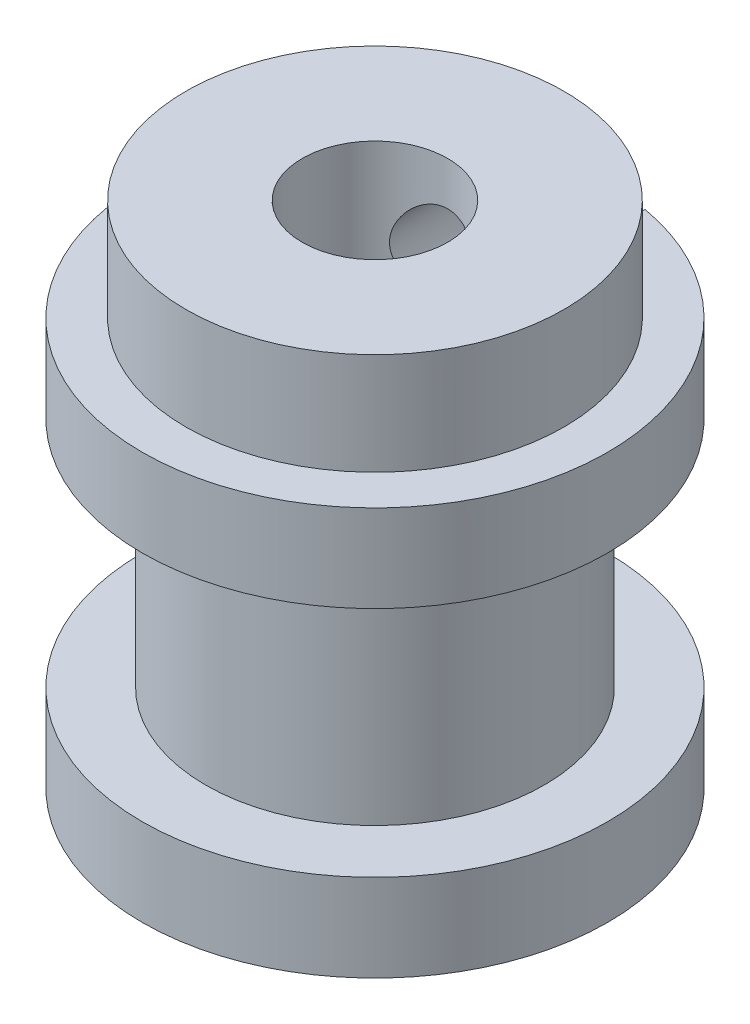
ISO-10303-21;
HEADER;
FILE_DESCRIPTION(('STEP AP214'),'2;1');
FILE_NAME('part.step','',(''),(''),'','','');
FILE_SCHEMA(('AUTOMOTIVE_DESIGN { 1 0 10303 214 1 1 1 1 }'));
ENDSEC;
DATA;
#1=APPLICATION_CONTEXT('core data for automotive mechanical design processes');
#2=APPLICATION_PROTOCOL_DEFINITION('international standard','automotive_design',2000,#1);
#3=PRODUCT_CONTEXT('',#1,'mechanical');
#4=PRODUCT('Part','Part','',(#3));
#5=PRODUCT_RELATED_PRODUCT_CATEGORY('part','',(#4));
#6=PRODUCT_DEFINITION_FORMATION('','',#4);
#7=PRODUCT_DEFINITION_CONTEXT('part definition',#1,'design');
#8=PRODUCT_DEFINITION('design','',#6,#7);
#9=PRODUCT_DEFINITION_SHAPE('','',#8);
#10=(LENGTH_UNIT() NAMED_UNIT(*) SI_UNIT(.MILLI.,.METRE.));
#11=(NAMED_UNIT(*) PLANE_ANGLE_UNIT() SI_UNIT($,.RADIAN.));
#12=(NAMED_UNIT(*) SI_UNIT($,.STERADIAN.) SOLID_ANGLE_UNIT());
#13=UNCERTAINTY_MEASURE_WITH_UNIT(LENGTH_MEASURE(1.E-05),#10,'distance_accuracy_value','');
#14=(GEOMETRIC_REPRESENTATION_CONTEXT(3) GLOBAL_UNCERTAINTY_ASSIGNED_CONTEXT((#13)) GLOBAL_UNIT_ASSIGNED_CONTEXT((#10,
#11,#12)) REPRESENTATION_CONTEXT('',''));
#15=CARTESIAN_POINT('',(0.,0.,0.));
#16=DIRECTION('',(0.,0.,1.));
#17=DIRECTION('',(1.,0.,0.));
#18=AXIS2_PLACEMENT_3D('',#15,#16,#17);
#19=CARTESIAN_POINT('',(8.,-7.,0.));
#20=DIRECTION('',(0.,1.,0.));
#21=DIRECTION('',(0.,0.,1.));
#22=AXIS2_PLACEMENT_3D('',#19,#20,#21);
#23=PLANE('',#22);
#24=CARTESIAN_POINT('',(0.,-7.,0.));
#25=DIRECTION('',(0.,1.,0.));
#26=DIRECTION('',(0.,0.,1.));
#27=AXIS2_PLACEMENT_3D('',#24,#25,#26);
#28=CIRCLE('',#27,8.);
#29=CARTESIAN_POINT('',(0.,-7.,8.));
#30=VERTEX_POINT('',#29);
#31=EDGE_CURVE('E127',#30,#30,#28,.T.);
#32=ORIENTED_EDGE('',*,*,#31,.F.);
#33=EDGE_LOOP('',(#32));
#34=FACE_BOUND('',#33,.T.);
#35=CARTESIAN_POINT('',(0.,-7.,0.));
#36=DIRECTION('',(0.,1.,0.));
#37=DIRECTION('',(0.,0.,1.));
#38=AXIS2_PLACEMENT_3D('',#35,#36,#37);
#39=CIRCLE('',#38,2.5);
#40=CARTESIAN_POINT('',(0.,-7.,2.5));
#41=VERTEX_POINT('',#40);
#42=EDGE_CURVE('E60',#41,#41,#39,.T.);
#43=ORIENTED_EDGE('',*,*,#42,.T.);
#44=EDGE_LOOP('',(#43));
#45=FACE_BOUND('',#44,.T.);
#46=ADVANCED_FACE('F48',(#34,#45),#23,.F.);
#47=CARTESIAN_POINT('',(0.,5.91926868955007,0.));
#48=DIRECTION('',(0.,1.,0.));
#49=DIRECTION('',(0.,0.,1.));
#50=AXIS2_PLACEMENT_3D('',#47,#48,#49);
#51=CYLINDRICAL_SURFACE('',#50,2.5);
#52=CARTESIAN_POINT('',(1.5,7.5,-2.));
#53=CARTESIAN_POINT('',(1.50000404108592,7.42452102471037,-1.99999416642512));
#54=CARTESIAN_POINT('',(1.49426852824014,7.34906156592021,-2.00433633903481));
#55=CARTESIAN_POINT('',(1.47174965152787,7.20067609603779,-2.02092590613883));
#56=CARTESIAN_POINT('',(1.45495475788936,7.1277528126149,-2.03318155043097));
#57=CARTESIAN_POINT('',(1.41143486335795,6.98691635832273,-2.0636233903473));
#58=CARTESIAN_POINT('',(1.3847815450315,6.91897116196473,-2.0817666618312));
#59=CARTESIAN_POINT('',(1.32252909283019,6.78856254663208,-2.12185904995836));
#60=CARTESIAN_POINT('',(1.28692729054693,6.72610077030486,-2.14380930122416));
#61=CARTESIAN_POINT('',(1.20271292747644,6.60005098333592,-2.19228594587542));
#62=CARTESIAN_POINT('',(1.15304179435289,6.53725904287606,-2.21904371037662));
#63=CARTESIAN_POINT('',(1.04426801309985,6.42023523725825,-2.27226229431061));
#64=CARTESIAN_POINT('',(0.985158296729613,6.3660098483292,-2.29872287517103));
#65=CARTESIAN_POINT('',(0.851442367411702,6.26186619029031,-2.35175567858734));
#66=CARTESIAN_POINT('',(0.775851995162548,6.21304553633025,-2.37803133577818));
#67=CARTESIAN_POINT('',(0.615654228271658,6.12919027755557,-2.42443786983179));
#68=CARTESIAN_POINT('',(0.53105519662633,6.09414302587729,-2.44457437988735));
#69=CARTESIAN_POINT('',(0.363771406742666,6.04240407718735,-2.4747098780044));
#70=CARTESIAN_POINT('',(0.281674698130915,6.02427963903271,-2.4854930393917));
#71=CARTESIAN_POINT('',(0.114970509382708,6.00205719713688,-2.49874939277545));
#72=CARTESIAN_POINT('',(0.0303654624001537,5.99794602199995,-2.50123038813308));
#73=CARTESIAN_POINT('',(-0.127637283737309,6.00361374734246,-2.49783372711539));
#74=CARTESIAN_POINT('',(-0.201123832865634,6.01173352616931,-2.49295437513726));
#75=CARTESIAN_POINT('',(-0.345464269151767,6.03847979564811,-2.47707997553857));
#76=CARTESIAN_POINT('',(-0.416317961051201,6.05710706390716,-2.46608447529309));
#77=CARTESIAN_POINT('',(-0.554056780469079,6.10416556270378,-2.4388490720172));
#78=CARTESIAN_POINT('',(-0.620916491037617,6.132653061139,-2.42257910450824));
#79=CARTESIAN_POINT('',(-0.74898866011561,6.19838461622554,-2.38609637638748));
#80=CARTESIAN_POINT('',(-0.810199646208011,6.23563094705901,-2.36588259201812));
#81=CARTESIAN_POINT('',(-0.933074267143199,6.32283909280445,-2.32037925976363));
#82=CARTESIAN_POINT('',(-0.993918663198193,6.37378831173574,-2.2947718295215));
#83=CARTESIAN_POINT('',(-1.10671465909274,6.48440411786018,-2.24255554245601));
#84=CARTESIAN_POINT('',(-1.1586540130834,6.54408250347451,-2.21594536703375));
#85=CARTESIAN_POINT('',(-1.25824837767417,6.67865340616356,-2.16111075123946));
#86=CARTESIAN_POINT('',(-1.30470933188632,6.75450757653946,-2.13305661385124));
#87=CARTESIAN_POINT('',(-1.38397217194232,6.91470623163661,-2.08250879557267));
#88=CARTESIAN_POINT('',(-1.41679921962189,6.99903471612564,-2.06000490298821));
#89=CARTESIAN_POINT('',(-1.46077497064842,7.15239363189535,-2.02895865196732));
#90=CARTESIAN_POINT('',(-1.47527903312665,7.22004063229665,-2.01833888618316));
#91=CARTESIAN_POINT('',(-1.49480872755284,7.35737361029948,-2.00392150777558));
#92=CARTESIAN_POINT('',(-1.49984538302907,7.42705712048457,-2.00011596115116));
#93=CARTESIAN_POINT('',(-1.50014781114183,7.56655168243571,-1.99988914321323));
#94=CARTESIAN_POINT('',(-1.49540004697659,7.63636277721521,-2.00347810223984));
#95=CARTESIAN_POINT('',(-1.47640290574941,7.77398734374856,-2.01751520788652));
#96=CARTESIAN_POINT('',(-1.46214601830139,7.84179919224026,-2.02796877613213));
#97=CARTESIAN_POINT('',(-1.42488312618657,7.97371457947979,-2.05431768333101));
#98=CARTESIAN_POINT('',(-1.40188805257362,8.03782263653223,-2.07020622092812));
#99=CARTESIAN_POINT('',(-1.34796261057072,8.16147771573018,-2.10571539417587));
#100=CARTESIAN_POINT('',(-1.31702924888212,8.221023006366,-2.12533743689999));
#101=CARTESIAN_POINT('',(-1.24167439558512,8.34524008251225,-2.17036819177737));
#102=CARTESIAN_POINT('',(-1.19582663060303,8.40890083509657,-2.19618239397369));
#103=CARTESIAN_POINT('',(-1.09487395518701,8.52828548484946,-2.24821754803621));
#104=CARTESIAN_POINT('',(-1.03976018672402,8.58400169216912,-2.27443886711455));
#105=CARTESIAN_POINT('',(-0.913274837212766,8.69322400735043,-2.32835625910913));
#106=CARTESIAN_POINT('',(-0.840721108780191,8.74550072660584,-2.3558007587587));
#107=CARTESIAN_POINT('',(-0.68610310086802,8.83690277683666,-2.40537639133459));
#108=CARTESIAN_POINT('',(-0.604045176134703,8.87603682784092,-2.42751104449411));
#109=CARTESIAN_POINT('',(-0.438840232972139,8.93686820343137,-2.46252280092775));
#110=CARTESIAN_POINT('',(-0.356205963651259,8.95962622779111,-2.47595588067329));
#111=CARTESIAN_POINT('',(-0.187383063890857,8.99071460284626,-2.494407389061));
#112=CARTESIAN_POINT('',(-0.101198571781969,8.99906129071763,-2.49943534582737));
#113=CARTESIAN_POINT('',(0.0598120232009843,9.00067460858593,-2.50040600461976));
#114=CARTESIAN_POINT('',(0.134620583589706,8.99580333456304,-2.49747057186327));
#115=CARTESIAN_POINT('',(0.282148755978774,8.97510617561839,-2.48512948412096));
#116=CARTESIAN_POINT('',(0.354868344701914,8.9592801686784,-2.47572375706639));
#117=CARTESIAN_POINT('',(0.495145481978797,8.91778042841621,-2.45149427526962));
#118=CARTESIAN_POINT('',(0.56276703260883,8.89226840387076,-2.43675966858906));
#119=CARTESIAN_POINT('',(0.692781971999984,8.83235940544525,-2.40303337447155));
#120=CARTESIAN_POINT('',(0.755174184199833,8.7979604391404,-2.38404073252268));
#121=CARTESIAN_POINT('',(0.880263645295948,8.71707480343125,-2.34093432659381));
#122=CARTESIAN_POINT('',(0.94225869043994,8.66968129098314,-2.31648844639149));
#123=CARTESIAN_POINT('',(1.05789751536307,8.56624696628228,-2.26601907350661));
#124=CARTESIAN_POINT('',(1.11153190956916,8.5101965743921,-2.23999385274509));
#125=CARTESIAN_POINT('',(1.2159097535057,8.3827144378223,-2.18528165666205));
#126=CARTESIAN_POINT('',(1.26542406663368,8.3102335138345,-2.15667566270901));
#127=CARTESIAN_POINT('',(1.35156817210325,8.15651514723346,-2.10376464485145));
#128=CARTESIAN_POINT('',(1.38820466322661,8.07528228601859,-2.07945738811052));
#129=CARTESIAN_POINT('',(1.44437116535132,7.9129357148628,-2.0408000304796));
#130=CARTESIAN_POINT('',(1.46509526060187,7.83240476403876,-2.02577665830138));
#131=CARTESIAN_POINT('',(1.49289268240426,7.66790260529632,-2.00539032320036));
#132=CARTESIAN_POINT('',(1.49999550595837,7.58393923424129,-2.00000648744643));
#133=CARTESIAN_POINT('',(1.5,7.5,-2.));
#134=B_SPLINE_CURVE_WITH_KNOTS('',3,(#52,#53,#54,#55,#56,#57,#58,#59,#60,#61,#62,#63,#64,#65,
#66,#67,#68,#69,#70,#71,#72,#73,#74,#75,#76,#77,#78,#79,#80,#81,#82,#83,#84,#85,#86,#87,#88,#89,
#90,#91,#92,#93,#94,#95,#96,#97,#98,#99,#100,#101,#102,#103,#104,#105,#106,#107,#108,#109,#110,
#111,#112,#113,#114,#115,#116,#117,#118,#119,#120,#121,#122,#123,#124,#125,#126,#127,#128,#129,
#130,#131,#132,#133),.UNSPECIFIED.,.T.,.F.,(4,2,2,2,2,2,2,2,2,2,2,2,2,2,2,2,2,2,2,2,2,2,2,2,2,2,
2,2,2,2,2,2,2,2,2,2,2,2,2,2,4),(0.,0.226085249493392,0.45240657433077,0.677113624991876,
0.901887762215932,1.15414462390001,1.40659128601844,1.68630157736223,1.9657544327122,
2.21853330858497,2.47107452602766,2.69230130543181,2.91354445887944,3.13607155036376,
3.35865648368878,3.60782810055849,3.85733966656908,4.13576671140276,4.41367760154768,
4.62276298054684,4.83160475643976,5.04073566011182,5.25003193304128,5.45906724365495,
5.66818149154661,5.91499438482002,6.16204457978455,6.44121828011589,6.72020638384847,
6.97891479383337,7.23732973022726,7.46129321849399,7.68525920139648,7.90563970188756,
8.12606965394584,8.37042963549487,8.61506198741955,8.89071695766604,9.16622832484805,
9.41820120134354,9.66962780912277),.UNSPECIFIED.);
#135=CARTESIAN_POINT('',(1.5,7.5,-2.));
#136=VERTEX_POINT('',#135);
#137=EDGE_CURVE('E124',#136,#136,#134,.T.);
#138=ORIENTED_EDGE('',*,*,#137,.T.);
#139=EDGE_LOOP('',(#138));
#140=FACE_BOUND('',#139,.T.);
#141=ORIENTED_EDGE('',*,*,#42,.F.);
#142=EDGE_LOOP('',(#141));
#143=FACE_BOUND('',#142,.T.);
#144=CARTESIAN_POINT('',(0.,10.5,0.));
#145=DIRECTION('',(0.,1.,0.));
#146=DIRECTION('',(0.,0.,1.));
#147=AXIS2_PLACEMENT_3D('',#144,#145,#146);
#148=CIRCLE('',#147,2.5);
#149=CARTESIAN_POINT('',(0.,10.5,2.5));
#150=VERTEX_POINT('',#149);
#151=EDGE_CURVE('E102',#150,#150,#148,.T.);
#152=ORIENTED_EDGE('',*,*,#151,.T.);
#153=EDGE_LOOP('',(#152));
#154=FACE_BOUND('',#153,.T.);
#155=ADVANCED_FACE('F108',(#140,#143,#154),#51,.F.);
#156=CARTESIAN_POINT('',(2.5,10.5,0.));
#157=DIRECTION('',(0.,-1.,0.));
#158=DIRECTION('',(0.,0.,-1.));
#159=AXIS2_PLACEMENT_3D('',#156,#157,#158);
#160=PLANE('',#159);
#161=ORIENTED_EDGE('',*,*,#151,.F.);
#162=EDGE_LOOP('',(#161));
#163=FACE_BOUND('',#162,.T.);
#164=CARTESIAN_POINT('',(0.,10.5,0.));
#165=DIRECTION('',(0.,1.,0.));
#166=DIRECTION('',(0.,0.,1.));
#167=AXIS2_PLACEMENT_3D('',#164,#165,#166);
#168=CIRCLE('',#167,6.5);
#169=CARTESIAN_POINT('',(0.,10.5,6.5));
#170=VERTEX_POINT('',#169);
#171=EDGE_CURVE('E93',#170,#170,#168,.T.);
#172=ORIENTED_EDGE('',*,*,#171,.T.);
#173=EDGE_LOOP('',(#172));
#174=FACE_BOUND('',#173,.T.);
#175=ADVANCED_FACE('F111',(#163,#174),#160,.F.);
#176=CARTESIAN_POINT('',(0.,5.91926868955007,0.));
#177=DIRECTION('',(0.,1.,0.));
#178=DIRECTION('',(0.,0.,1.));
#179=AXIS2_PLACEMENT_3D('',#176,#177,#178);
#180=CYLINDRICAL_SURFACE('',#179,6.5);
#181=ORIENTED_EDGE('',*,*,#171,.F.);
#182=EDGE_LOOP('',(#181));
#183=FACE_BOUND('',#182,.T.);
#184=CARTESIAN_POINT('',(0.,7.,0.));
#185=DIRECTION('',(0.,1.,0.));
#186=DIRECTION('',(0.,0.,1.));
#187=AXIS2_PLACEMENT_3D('',#184,#185,#186);
#188=CIRCLE('',#187,6.5);
#189=CARTESIAN_POINT('',(-1.41421356237309,7.,-6.34428877022476));
#190=VERTEX_POINT('',#189);
#191=CARTESIAN_POINT('',(1.41421356237309,7.,-6.34428877022476));
#192=VERTEX_POINT('',#191);
#193=EDGE_CURVE('E87',#190,#192,#188,.T.);
#194=ORIENTED_EDGE('',*,*,#193,.T.);
#195=CARTESIAN_POINT('',(1.41421356237309,7.,-6.34428877022476));
#196=CARTESIAN_POINT('',(1.42792544802736,7.03878364205071,-6.34123054576178));
#197=CARTESIAN_POINT('',(1.44004285398166,7.07813637830102,-6.33848473931084));
#198=CARTESIAN_POINT('',(1.46101243436852,7.15774438097582,-6.3336846968901));
#199=CARTESIAN_POINT('',(1.46986452611735,7.19799967022723,-6.33163047843268));
#200=CARTESIAN_POINT('',(1.49138032059779,7.31960928420259,-6.3266118608885));
#201=CARTESIAN_POINT('',(1.49905598386253,7.40195590793724,-6.32477942717436));
#202=CARTESIAN_POINT('',(1.50078158689988,7.56682601120066,-6.3243697356905));
#203=CARTESIAN_POINT('',(1.49482047081279,7.64934957999949,-6.32579511915719));
#204=CARTESIAN_POINT('',(1.46946570007972,7.81217777427911,-6.33173258170924));
#205=CARTESIAN_POINT('',(1.45007502648616,7.89248288809276,-6.3362439757686));
#206=CARTESIAN_POINT('',(1.39848968785356,8.04862234895824,-6.34782788911907));
#207=CARTESIAN_POINT('',(1.3663004911954,8.1244585895412,-6.35489931447909));
#208=CARTESIAN_POINT('',(1.29005780378515,8.26972956503315,-6.37081326300567));
#209=CARTESIAN_POINT('',(1.24600030108219,8.33916212457421,-6.37965638481527));
#210=CARTESIAN_POINT('',(1.14607564409846,8.47135609473484,-6.39837060244125));
#211=CARTESIAN_POINT('',(1.0899595498279,8.53392670898228,-6.40826070327259));
#212=CARTESIAN_POINT('',(0.968062625802108,8.64885700101563,-6.42780351934555));
#213=CARTESIAN_POINT('',(0.902281682769289,8.70121655910537,-6.43745623180329));
#214=CARTESIAN_POINT('',(0.761866314437374,8.79490294643286,-6.45558887270695));
#215=CARTESIAN_POINT('',(0.687127910465141,8.8360775007656,-6.46405192357595));
#216=CARTESIAN_POINT('',(0.531566913094912,8.90523293905463,-6.47869828379367));
#217=CARTESIAN_POINT('',(0.450744902772572,8.9332150855583,-6.48488181128628));
#218=CARTESIAN_POINT('',(0.286713661243345,8.9747320989039,-6.49418428779454));
#219=CARTESIAN_POINT('',(0.203565285714172,8.9884962874125,-6.49735181423764));
#220=CARTESIAN_POINT('',(0.0360833562080674,9.00191648158361,-6.50043909536231));
#221=CARTESIAN_POINT('',(-0.0482500306493305,9.00157445704296,-6.50035930350063));
#222=CARTESIAN_POINT('',(-0.213947324863506,8.98694611580808,-6.49699639188661));
#223=CARTESIAN_POINT('',(-0.295336999939644,8.97293471658108,-6.49377642753804));
#224=CARTESIAN_POINT('',(-0.45457468463359,8.93182559460456,-6.48457602824185));
#225=CARTESIAN_POINT('',(-0.532422532938321,8.90472727646072,-6.47859546770042));
#226=CARTESIAN_POINT('',(-0.682978718076873,8.83804506396051,-6.46446445369388));
#227=CARTESIAN_POINT('',(-0.755649328507446,8.79837913073633,-6.45629979903346));
#228=CARTESIAN_POINT('',(-0.893392269208307,8.70774572840883,-6.43868611845279));
#229=CARTESIAN_POINT('',(-0.958463512045209,8.65677664489607,-6.42923690913649));
#230=CARTESIAN_POINT('',(-1.08075553049814,8.54358453183375,-6.40982800986239));
#231=CARTESIAN_POINT('',(-1.13775914094837,8.48112783584684,-6.39986156262732));
#232=CARTESIAN_POINT('',(-1.24053517446216,8.34745526297307,-6.38073764690478));
#233=CARTESIAN_POINT('',(-1.28630715886595,8.27623904413936,-6.37158021002276));
#234=CARTESIAN_POINT('',(-1.36550392410974,8.12657888618538,-6.35508070693306));
#235=CARTESIAN_POINT('',(-1.39886611772535,8.04810073805387,-6.34774790286766));
#236=CARTESIAN_POINT('',(-1.45186305610442,7.88642758029397,-6.33583767771737));
#237=CARTESIAN_POINT('',(-1.47149832596622,7.8032327512252,-6.3312601512353));
#238=CARTESIAN_POINT('',(-1.49610815775514,7.63644320094384,-6.32548950254846));
#239=CARTESIAN_POINT('',(-1.50139092593915,7.55289613425597,-6.32422525232962));
#240=CARTESIAN_POINT('',(-1.49798952499848,7.3861371668435,-6.3250323110257));
#241=CARTESIAN_POINT('',(-1.48931895259228,7.30292501895186,-6.32710037279897));
#242=CARTESIAN_POINT('',(-1.46673792593375,7.18352956422509,-6.3323554050161));
#243=CARTESIAN_POINT('',(-1.45818208571419,7.14620578224421,-6.33433586655116));
#244=CARTESIAN_POINT('',(-1.43827518593424,7.07242664149467,-6.3388853214296));
#245=CARTESIAN_POINT('',(-1.42692965860708,7.03596971870847,-6.34145314927154));
#246=CARTESIAN_POINT('',(-1.41421356237309,7.,-6.34428877022476));
#247=B_SPLINE_CURVE_WITH_KNOTS('',3,(#195,#196,#197,#198,#199,#200,#201,#202,#203,#204,#205,
#206,#207,#208,#209,#210,#211,#212,#213,#214,#215,#216,#217,#218,#219,#220,#221,#222,#223,#224,
#225,#226,#227,#228,#229,#230,#231,#232,#233,#234,#235,#236,#237,#238,#239,#240,#241,#242,#243,
#244,#245,#246),.UNSPECIFIED.,.F.,.F.,(4,2,2,2,2,2,2,2,2,2,2,2,2,2,2,2,2,2,2,2,2,2,2,2,2,4),(0.,
0.123676283722239,0.247355698939033,0.494246539392942,0.741337614645333,0.988373858942743,
1.23530466614463,1.48231905057624,1.73503053663391,1.98774498485164,2.24374473444787,
2.4997199792332,2.75149888814722,3.00324263867977,3.25002555520106,3.49681970026171,
3.74525926303234,3.99373433287682,4.24797426163164,4.50222411834179,4.75773940431154,
5.01324491547691,5.26321863199769,5.51294891113678,5.62788061140329,5.74258620308935),.UNSPECIFIED.);
#248=EDGE_CURVE('E71',#192,#190,#247,.T.);
#249=ORIENTED_EDGE('',*,*,#248,.T.);
#250=EDGE_LOOP('',(#194,#249));
#251=FACE_BOUND('',#250,.T.);
#252=ADVANCED_FACE('F117',(#183,#251),#180,.T.);
#253=CARTESIAN_POINT('',(6.5,7.,0.));
#254=DIRECTION('',(0.,-1.,0.));
#255=DIRECTION('',(0.,0.,-1.));
#256=AXIS2_PLACEMENT_3D('',#253,#254,#255);
#257=PLANE('',#256);
#258=CARTESIAN_POINT('',(0.,7.,0.));
#259=DIRECTION('',(0.,1.,0.));
#260=DIRECTION('',(0.,0.,1.));
#261=AXIS2_PLACEMENT_3D('',#258,#259,#260);
#262=CIRCLE('',#261,8.);
#263=CARTESIAN_POINT('',(-1.41421356237309,7.,-7.87400787401181));
#264=VERTEX_POINT('',#263);
#265=CARTESIAN_POINT('',(1.41421356237309,7.,-7.87400787401181));
#266=VERTEX_POINT('',#265);
#267=EDGE_CURVE('E85',#264,#266,#262,.T.);
#268=ORIENTED_EDGE('',*,*,#267,.T.);
#269=DIRECTION('',(0.,0.,1.));
#270=VECTOR('',#269,1.);
#271=CARTESIAN_POINT('',(1.41421356237309,7.,-8.));
#272=LINE('',#271,#270);
#273=EDGE_CURVE('E67',#266,#192,#272,.T.);
#274=ORIENTED_EDGE('',*,*,#273,.T.);
#275=ORIENTED_EDGE('',*,*,#193,.F.);
#276=DIRECTION('',(0.,0.,1.));
#277=VECTOR('',#276,1.);
#278=CARTESIAN_POINT('',(-1.41421356237309,7.,-8.));
#279=LINE('',#278,#277);
#280=EDGE_CURVE('E78',#190,#264,#279,.F.);
#281=ORIENTED_EDGE('',*,*,#280,.T.);
#282=EDGE_LOOP('',(#268,#274,#275,#281));
#283=FACE_BOUND('',#282,.T.);
#284=ADVANCED_FACE('F84',(#283),#257,.F.);
#285=CARTESIAN_POINT('',(0.,5.91926868955007,0.));
#286=DIRECTION('',(0.,1.,0.));
#287=DIRECTION('',(0.,0.,1.));
#288=AXIS2_PLACEMENT_3D('',#285,#286,#287);
#289=CYLINDRICAL_SURFACE('',#288,8.);
#290=ORIENTED_EDGE('',*,*,#267,.F.);
#291=CARTESIAN_POINT('',(-1.41421356237309,7.,-7.87400787401181));
#292=CARTESIAN_POINT('',(-1.40010842831156,6.96010543033283,-7.87653974951591));
#293=CARTESIAN_POINT('',(-1.38432719706825,6.92084328424445,-7.87933655348431));
#294=CARTESIAN_POINT('',(-1.34952547239986,6.84382292230749,-7.88537243790574));
#295=CARTESIAN_POINT('',(-1.3305053826783,6.8060645197495,-7.88861146322867));
#296=CARTESIAN_POINT('',(-1.2688210450913,6.69551559986022,-7.89884984641749));
#297=CARTESIAN_POINT('',(-1.22148345417006,6.62531261353435,-7.90637981785332));
#298=CARTESIAN_POINT('',(-1.11575414324113,6.49391084033904,-7.92199092618765));
#299=CARTESIAN_POINT('',(-1.05736079559017,6.43271338163606,-7.93007214412918));
#300=CARTESIAN_POINT('',(-0.931106496998043,6.32095676120397,-7.94588445301105));
#301=CARTESIAN_POINT('',(-0.86324638478069,6.27039665803482,-7.95361557488843));
#302=CARTESIAN_POINT('',(-0.719602928048923,6.18115515047975,-7.96789779794741));
#303=CARTESIAN_POINT('',(-0.643787458827353,6.14252460244345,-7.97444379918369));
#304=CARTESIAN_POINT('',(-0.486588230869499,6.07858158884921,-7.98557658927813));
#305=CARTESIAN_POINT('',(-0.405204329315162,6.05326946502439,-7.99016332786364));
#306=CARTESIAN_POINT('',(-0.240236630122838,6.01698532006603,-7.99681284161172));
#307=CARTESIAN_POINT('',(-0.156691491130891,6.00584308003227,-7.99890555718576));
#308=CARTESIAN_POINT('',(0.0111025193377212,5.99769169379955,-8.00043204947751));
#309=CARTESIAN_POINT('',(0.0953513011355175,6.0006807732035,-7.99986616002265));
#310=CARTESIAN_POINT('',(0.261095108581675,6.02057000129191,-7.99616293671388));
#311=CARTESIAN_POINT('',(0.34261108018612,6.037302158506,-7.99305665781943));
#312=CARTESIAN_POINT('',(0.501656591382663,6.08394601148902,-7.98465319372484));
#313=CARTESIAN_POINT('',(0.579186116378266,6.11385775551156,-7.97935600050324));
#314=CARTESIAN_POINT('',(0.728609932800193,6.18620339915145,-7.96710660980214));
#315=CARTESIAN_POINT('',(0.800466572508678,6.22871329428024,-7.9601444192796));
#316=CARTESIAN_POINT('',(0.936118809745383,6.32500969552367,-7.94533486357345));
#317=CARTESIAN_POINT('',(0.999910974988458,6.37880097733452,-7.93748712416662));
#318=CARTESIAN_POINT('',(1.11864468466962,6.49711714838506,-7.92163400641742));
#319=CARTESIAN_POINT('',(1.17342964343849,6.56179888191494,-7.91362810335568));
#320=CARTESIAN_POINT('',(1.27132491420095,6.69947307404347,-7.89849304426737));
#321=CARTESIAN_POINT('',(1.31445354248319,6.7724522349597,-7.89136252243993));
#322=CARTESIAN_POINT('',(1.36301912154595,6.87315640987265,-7.88304017867058));
#323=CARTESIAN_POINT('',(1.37423444051909,6.89814304630221,-7.88109091874425));
#324=CARTESIAN_POINT('',(1.39526884175688,6.94866504501404,-7.87739414730899));
#325=CARTESIAN_POINT('',(1.40509011424297,6.97419947231899,-7.87564632015519));
#326=CARTESIAN_POINT('',(1.41421356237312,6.99999999999999,-7.87400787401181));
#327=B_SPLINE_CURVE_WITH_KNOTS('',3,(#291,#292,#293,#294,#295,#296,#297,#298,#299,#300,#301,
#302,#303,#304,#305,#306,#307,#308,#309,#310,#311,#312,#313,#314,#315,#316,#317,#318,#319,#320,
#321,#322,#323,#324,#325,#326),.UNSPECIFIED.,.F.,.F.,(4,2,2,2,2,2,2,2,2,2,2,2,2,2,2,2,2,4),(0.,
0.127090190980262,0.254164552540313,0.507876341209676,0.761625510752819,1.01535221322556,
1.27014609252395,1.52494650917678,1.77665623757774,2.02833436092233,2.27698103964444,
2.52562862872905,2.77580776527542,3.02609302352263,3.28035168546788,3.53420846150714,
3.61655099004514,3.69876268120089),.UNSPECIFIED.);
#328=EDGE_CURVE('E13',#264,#266,#327,.T.);
#329=ORIENTED_EDGE('',*,*,#328,.T.);
#330=EDGE_LOOP('',(#290,#329));
#331=FACE_BOUND('',#330,.T.);
#332=CARTESIAN_POINT('',(0.,4.,0.));
#333=DIRECTION('',(0.,1.,0.));
#334=DIRECTION('',(0.,0.,1.));
#335=AXIS2_PLACEMENT_3D('',#332,#333,#334);
#336=CIRCLE('',#335,8.);
#337=CARTESIAN_POINT('',(0.,4.,8.));
#338=VERTEX_POINT('',#337);
#339=EDGE_CURVE('E91',#338,#338,#336,.T.);
#340=ORIENTED_EDGE('',*,*,#339,.T.);
#341=EDGE_LOOP('',(#340));
#342=FACE_BOUND('',#341,.T.);
#343=ADVANCED_FACE('F89',(#331,#342),#289,.T.);
#344=CARTESIAN_POINT('',(8.,4.,0.));
#345=DIRECTION('',(0.,1.,0.));
#346=DIRECTION('',(0.,0.,1.));
#347=AXIS2_PLACEMENT_3D('',#344,#345,#346);
#348=PLANE('',#347);
#349=ORIENTED_EDGE('',*,*,#339,.F.);
#350=EDGE_LOOP('',(#349));
#351=FACE_BOUND('',#350,.T.);
#352=CARTESIAN_POINT('',(0.,4.,0.));
#353=DIRECTION('',(0.,1.,0.));
#354=DIRECTION('',(0.,0.,1.));
#355=AXIS2_PLACEMENT_3D('',#352,#353,#354);
#356=CIRCLE('',#355,5.82);
#357=CARTESIAN_POINT('',(0.,4.,5.82));
#358=VERTEX_POINT('',#357);
#359=EDGE_CURVE('E96',#358,#358,#356,.T.);
#360=ORIENTED_EDGE('',*,*,#359,.T.);
#361=EDGE_LOOP('',(#360));
#362=FACE_BOUND('',#361,.T.);
#363=ADVANCED_FACE('F154',(#351,#362),#348,.F.);
#364=CARTESIAN_POINT('',(0.,5.91926868955007,0.));
#365=DIRECTION('',(0.,1.,0.));
#366=DIRECTION('',(0.,0.,1.));
#367=AXIS2_PLACEMENT_3D('',#364,#365,#366);
#368=CYLINDRICAL_SURFACE('',#367,5.82);
#369=ORIENTED_EDGE('',*,*,#359,.F.);
#370=EDGE_LOOP('',(#369));
#371=FACE_BOUND('',#370,.T.);
#372=CARTESIAN_POINT('',(0.,-4.,0.));
#373=DIRECTION('',(0.,1.,0.));
#374=DIRECTION('',(0.,0.,1.));
#375=AXIS2_PLACEMENT_3D('',#372,#373,#374);
#376=CIRCLE('',#375,5.82);
#377=CARTESIAN_POINT('',(0.,-4.,5.82));
#378=VERTEX_POINT('',#377);
#379=EDGE_CURVE('E172',#378,#378,#376,.T.);
#380=ORIENTED_EDGE('',*,*,#379,.T.);
#381=EDGE_LOOP('',(#380));
#382=FACE_BOUND('',#381,.T.);
#383=ADVANCED_FACE('F150',(#371,#382),#368,.T.);
#384=CARTESIAN_POINT('',(5.82,-4.,0.));
#385=DIRECTION('',(0.,-1.,0.));
#386=DIRECTION('',(0.,0.,-1.));
#387=AXIS2_PLACEMENT_3D('',#384,#385,#386);
#388=PLANE('',#387);
#389=ORIENTED_EDGE('',*,*,#379,.F.);
#390=EDGE_LOOP('',(#389));
#391=FACE_BOUND('',#390,.T.);
#392=CARTESIAN_POINT('',(0.,-4.,0.));
#393=DIRECTION('',(0.,1.,0.));
#394=DIRECTION('',(0.,0.,1.));
#395=AXIS2_PLACEMENT_3D('',#392,#393,#394);
#396=CIRCLE('',#395,8.);
#397=CARTESIAN_POINT('',(0.,-4.,8.));
#398=VERTEX_POINT('',#397);
#399=EDGE_CURVE('E170',#398,#398,#396,.T.);
#400=ORIENTED_EDGE('',*,*,#399,.T.);
#401=EDGE_LOOP('',(#400));
#402=FACE_BOUND('',#401,.T.);
#403=ADVANCED_FACE('F146',(#391,#402),#388,.F.);
#404=CARTESIAN_POINT('',(0.,5.91926868955007,0.));
#405=DIRECTION('',(0.,1.,0.));
#406=DIRECTION('',(0.,0.,1.));
#407=AXIS2_PLACEMENT_3D('',#404,#405,#406);
#408=CYLINDRICAL_SURFACE('',#407,8.);
#409=ORIENTED_EDGE('',*,*,#399,.F.);
#410=EDGE_LOOP('',(#409));
#411=FACE_BOUND('',#410,.T.);
#412=ORIENTED_EDGE('',*,*,#31,.T.);
#413=EDGE_LOOP('',(#412));
#414=FACE_BOUND('',#413,.T.);
#415=ADVANCED_FACE('F141',(#411,#414),#408,.T.);
#416=CARTESIAN_POINT('',(0.,7.5,-8.));
#417=DIRECTION('',(0.,0.,1.));
#418=DIRECTION('',(1.,0.,0.));
#419=AXIS2_PLACEMENT_3D('',#416,#417,#418);
#420=CYLINDRICAL_SURFACE('',#419,1.5);
#421=ORIENTED_EDGE('',*,*,#273,.F.);
#422=ORIENTED_EDGE('',*,*,#328,.F.);
#423=ORIENTED_EDGE('',*,*,#280,.F.);
#424=ORIENTED_EDGE('',*,*,#248,.F.);
#425=EDGE_LOOP('',(#421,#422,#423,#424));
#426=FACE_BOUND('',#425,.T.);
#427=ORIENTED_EDGE('',*,*,#137,.F.);
#428=EDGE_LOOP('',(#427));
#429=FACE_BOUND('',#428,.T.);
#430=ADVANCED_FACE('F76',(#426,#429),#420,.F.);
#431=CLOSED_SHELL('',(#46,#155,#175,#252,#284,#343,#363,#383,#403,#415,#430));
#432=MANIFOLD_SOLID_BREP('B2',#431);
#433=ADVANCED_BREP_SHAPE_REPRESENTATION('',(#18,#432),#14);
#434=SHAPE_DEFINITION_REPRESENTATION(#9,#433);
ENDSEC;
END-ISO-10303-21;
